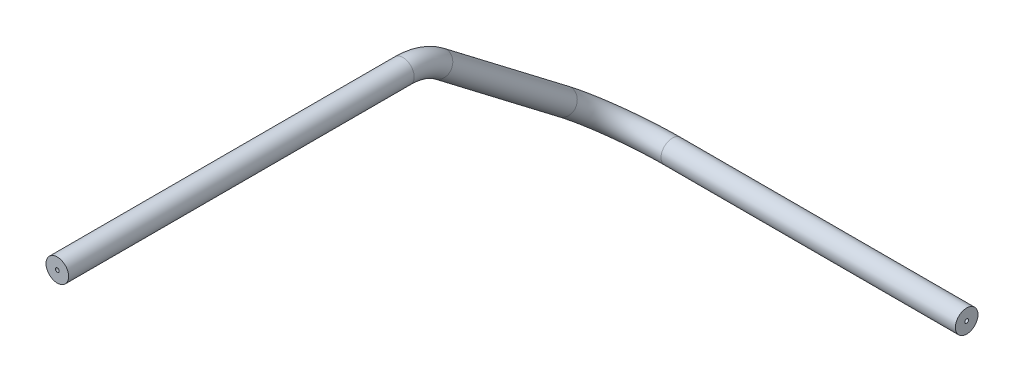
ISO-10303-21;
HEADER;
FILE_DESCRIPTION(('STEP AP214'),'2;1');
FILE_NAME('part.step','',(''),(''),'','','');
FILE_SCHEMA(('AUTOMOTIVE_DESIGN { 1 0 10303 214 1 1 1 1 }'));
ENDSEC;
DATA;
#1=APPLICATION_CONTEXT('core data for automotive mechanical design processes');
#2=APPLICATION_PROTOCOL_DEFINITION('international standard','automotive_design',2000,#1);
#3=PRODUCT_CONTEXT('',#1,'mechanical');
#4=PRODUCT('Part','Part','',(#3));
#5=PRODUCT_RELATED_PRODUCT_CATEGORY('part','',(#4));
#6=PRODUCT_DEFINITION_FORMATION('','',#4);
#7=PRODUCT_DEFINITION_CONTEXT('part definition',#1,'design');
#8=PRODUCT_DEFINITION('design','',#6,#7);
#9=PRODUCT_DEFINITION_SHAPE('','',#8);
#10=(LENGTH_UNIT() NAMED_UNIT(*) SI_UNIT(.MILLI.,.METRE.));
#11=(NAMED_UNIT(*) PLANE_ANGLE_UNIT() SI_UNIT($,.RADIAN.));
#12=(NAMED_UNIT(*) SI_UNIT($,.STERADIAN.) SOLID_ANGLE_UNIT());
#13=UNCERTAINTY_MEASURE_WITH_UNIT(LENGTH_MEASURE(1.E-05),#10,'distance_accuracy_value','');
#14=(GEOMETRIC_REPRESENTATION_CONTEXT(3) GLOBAL_UNCERTAINTY_ASSIGNED_CONTEXT((#13)) GLOBAL_UNIT_ASSIGNED_CONTEXT((#10,
#11,#12)) REPRESENTATION_CONTEXT('',''));
#15=CARTESIAN_POINT('',(0.,0.,0.));
#16=DIRECTION('',(0.,0.,1.));
#17=DIRECTION('',(1.,0.,0.));
#18=AXIS2_PLACEMENT_3D('',#15,#16,#17);
#19=CARTESIAN_POINT('',(94.,0.,0.));
#20=DIRECTION('',(-1.,0.,0.));
#21=DIRECTION('',(0.,-1.,0.));
#22=AXIS2_PLACEMENT_3D('',#19,#20,#21);
#23=CYLINDRICAL_SURFACE('',#22,3.);
#24=CARTESIAN_POINT('',(16.,0.,0.));
#25=DIRECTION('',(1.,0.,0.));
#26=DIRECTION('',(0.,0.,-1.));
#27=AXIS2_PLACEMENT_3D('',#24,#25,#26);
#28=CIRCLE('',#27,3.);
#29=CARTESIAN_POINT('',(16.,-1.82128832393702,-2.38388524075526));
#30=VERTEX_POINT('',#29);
#31=EDGE_CURVE('E61',#30,#30,#28,.T.);
#32=ORIENTED_EDGE('',*,*,#31,.T.);
#33=EDGE_LOOP('',(#32));
#34=FACE_BOUND('',#33,.T.);
#35=CARTESIAN_POINT('',(94.,0.,0.));
#36=DIRECTION('',(1.,0.,0.));
#37=DIRECTION('',(0.,0.,-1.));
#38=AXIS2_PLACEMENT_3D('',#35,#36,#37);
#39=CIRCLE('',#38,3.);
#40=CARTESIAN_POINT('',(94.,0.,-3.));
#41=VERTEX_POINT('',#40);
#42=EDGE_CURVE('E58',#41,#41,#39,.T.);
#43=ORIENTED_EDGE('',*,*,#42,.F.);
#44=EDGE_LOOP('',(#43));
#45=FACE_BOUND('',#44,.T.);
#46=ADVANCED_FACE('F37',(#34,#45),#23,.T.);
#47=CARTESIAN_POINT('',(16.,9.71353772766406,12.7140546173613));
#48=DIRECTION('',(0.,0.794628413585083,-0.607096107979003));
#49=DIRECTION('',(0.,0.607096107979003,0.794628413585083));
#50=AXIS2_PLACEMENT_3D('',#47,#48,#49);
#51=TOROIDAL_SURFACE('',#50,16.,3.);
#52=CARTESIAN_POINT('',(0.,9.71353772766406,12.7140546173613));
#53=DIRECTION('',(0.,-0.607096107979003,-0.794628413585083));
#54=DIRECTION('',(-0.794628413585083,0.482415817177034,-0.368565684323254));
#55=AXIS2_PLACEMENT_3D('',#52,#53,#54);
#56=CIRCLE('',#55,3.);
#57=CARTESIAN_POINT('',(-3.00000000000002,9.71353772766406,12.7140546173613));
#58=VERTEX_POINT('',#57);
#59=EDGE_CURVE('E64',#58,#58,#56,.T.);
#60=CARTESIAN_POINT('',(16.,9.71353772766406,12.7140546173613));
#61=DIRECTION('',(0.,0.794628413585083,-0.607096107979003));
#62=DIRECTION('',(0.,0.607096107979003,0.794628413585083));
#63=AXIS2_PLACEMENT_3D('',#60,#61,#62);
#64=CIRCLE('',#63,19.);
#65=EDGE_CURVE('',#30,#58,#64,.T.);
#66=ORIENTED_EDGE('',*,*,#31,.F.);
#67=ORIENTED_EDGE('',*,*,#59,.T.);
#68=ORIENTED_EDGE('',*,*,#65,.T.);
#69=ORIENTED_EDGE('',*,*,#65,.F.);
#70=EDGE_LOOP('',(#66,#68,#67,#69));
#71=FACE_BOUND('',#70,.T.);
#72=ADVANCED_FACE('F106',(#71),#51,.T.);
#73=CARTESIAN_POINT('',(0.,9.71353772766406,12.7140546173613));
#74=DIRECTION('',(0.,0.607096107979004,0.794628413585083));
#75=DIRECTION('',(0.,-0.794628413585083,0.607096107979004));
#76=AXIS2_PLACEMENT_3D('',#73,#74,#75);
#77=CYLINDRICAL_SURFACE('',#76,3.);
#78=CARTESIAN_POINT('',(0.,34.9140546173614,45.699024368274));
#79=DIRECTION('',(0.,-0.607096107979004,-0.794628413585083));
#80=DIRECTION('',(-0.794628413585083,0.482415817177034,-0.368565684323254));
#81=AXIS2_PLACEMENT_3D('',#78,#79,#80);
#82=CIRCLE('',#81,3.);
#83=CARTESIAN_POINT('',(0.,37.2979398581166,43.877736044337));
#84=VERTEX_POINT('',#83);
#85=EDGE_CURVE('E66',#84,#84,#82,.T.);
#86=ORIENTED_EDGE('',*,*,#85,.T.);
#87=EDGE_LOOP('',(#86));
#88=FACE_BOUND('',#87,.T.);
#89=ORIENTED_EDGE('',*,*,#59,.F.);
#90=EDGE_LOOP('',(#89));
#91=FACE_BOUND('',#90,.T.);
#92=ADVANCED_FACE('F86',(#88,#91),#77,.T.);
#93=CARTESIAN_POINT('',(0.,22.2,55.4125620959381));
#94=DIRECTION('',(1.,0.,0.));
#95=DIRECTION('',(0.,0.,-1.));
#96=AXIS2_PLACEMENT_3D('',#93,#94,#95);
#97=TOROIDAL_SURFACE('',#96,16.,3.);
#98=CARTESIAN_POINT('',(0.,38.2,55.4125620959381));
#99=DIRECTION('',(0.,0.,-1.));
#100=DIRECTION('',(-0.794628413585083,0.607096107979003,0.));
#101=AXIS2_PLACEMENT_3D('',#98,#99,#100);
#102=CIRCLE('',#101,3.);
#103=CARTESIAN_POINT('',(0.,41.2,55.4125620959381));
#104=VERTEX_POINT('',#103);
#105=EDGE_CURVE('E41',#104,#104,#102,.T.);
#106=CARTESIAN_POINT('',(0.,22.2,55.4125620959381));
#107=DIRECTION('',(1.,0.,0.));
#108=DIRECTION('',(0.,0.,-1.));
#109=AXIS2_PLACEMENT_3D('',#106,#107,#108);
#110=CIRCLE('',#109,19.);
#111=EDGE_CURVE('',#84,#104,#110,.T.);
#112=ORIENTED_EDGE('',*,*,#85,.F.);
#113=ORIENTED_EDGE('',*,*,#105,.T.);
#114=ORIENTED_EDGE('',*,*,#111,.T.);
#115=ORIENTED_EDGE('',*,*,#111,.F.);
#116=EDGE_LOOP('',(#112,#114,#113,#115));
#117=FACE_BOUND('',#116,.T.);
#118=ADVANCED_FACE('F73',(#117),#97,.T.);
#119=CARTESIAN_POINT('',(0.,38.2,55.4125620959381));
#120=DIRECTION('',(0.,0.,1.));
#121=DIRECTION('',(0.,-1.,0.));
#122=AXIS2_PLACEMENT_3D('',#119,#120,#121);
#123=CYLINDRICAL_SURFACE('',#122,3.);
#124=CARTESIAN_POINT('',(0.,38.2,147.));
#125=DIRECTION('',(0.,0.,-1.));
#126=DIRECTION('',(-0.794628413585083,0.607096107979003,0.));
#127=AXIS2_PLACEMENT_3D('',#124,#125,#126);
#128=CIRCLE('',#127,3.);
#129=CARTESIAN_POINT('',(-2.38388524075525,40.021288323937,147.));
#130=VERTEX_POINT('',#129);
#131=EDGE_CURVE('E54',#130,#130,#128,.T.);
#132=ORIENTED_EDGE('',*,*,#131,.T.);
#133=EDGE_LOOP('',(#132));
#134=FACE_BOUND('',#133,.T.);
#135=ORIENTED_EDGE('',*,*,#105,.F.);
#136=EDGE_LOOP('',(#135));
#137=FACE_BOUND('',#136,.T.);
#138=ADVANCED_FACE('F39',(#134,#137),#123,.T.);
#139=CARTESIAN_POINT('',(94.,0.,0.));
#140=DIRECTION('',(1.,0.,0.));
#141=DIRECTION('',(0.,0.,-1.));
#142=AXIS2_PLACEMENT_3D('',#139,#140,#141);
#143=PLANE('',#142);
#144=CARTESIAN_POINT('',(94.,0.,0.));
#145=DIRECTION('',(1.,0.,0.));
#146=DIRECTION('',(0.,0.,-1.));
#147=AXIS2_PLACEMENT_3D('',#144,#145,#146);
#148=CIRCLE('',#147,0.5);
#149=CARTESIAN_POINT('',(94.,0.,-0.5));
#150=VERTEX_POINT('',#149);
#151=EDGE_CURVE('E57',#150,#150,#148,.F.);
#152=ORIENTED_EDGE('',*,*,#151,.T.);
#153=EDGE_LOOP('',(#152));
#154=FACE_BOUND('',#153,.T.);
#155=ORIENTED_EDGE('',*,*,#42,.T.);
#156=EDGE_LOOP('',(#155));
#157=FACE_BOUND('',#156,.T.);
#158=ADVANCED_FACE('F77',(#154,#157),#143,.T.);
#159=CARTESIAN_POINT('',(0.,38.2,147.));
#160=DIRECTION('',(0.,0.,-1.));
#161=DIRECTION('',(-0.794628413585083,0.607096107979003,0.));
#162=AXIS2_PLACEMENT_3D('',#159,#160,#161);
#163=PLANE('',#162);
#164=CARTESIAN_POINT('',(0.,38.2,147.));
#165=DIRECTION('',(0.,0.,-1.));
#166=DIRECTION('',(-0.794628413585083,0.607096107979003,0.));
#167=AXIS2_PLACEMENT_3D('',#164,#165,#166);
#168=CIRCLE('',#167,0.5);
#169=CARTESIAN_POINT('',(-0.397314206792542,38.5035480539895,147.));
#170=VERTEX_POINT('',#169);
#171=EDGE_CURVE('E10',#170,#170,#168,.F.);
#172=ORIENTED_EDGE('',*,*,#171,.F.);
#173=EDGE_LOOP('',(#172));
#174=FACE_BOUND('',#173,.T.);
#175=ORIENTED_EDGE('',*,*,#131,.F.);
#176=EDGE_LOOP('',(#175));
#177=FACE_BOUND('',#176,.T.);
#178=ADVANCED_FACE('F83',(#174,#177),#163,.F.);
#179=CARTESIAN_POINT('',(94.,0.,0.));
#180=DIRECTION('',(-1.,0.,0.));
#181=DIRECTION('',(0.,-1.,0.));
#182=AXIS2_PLACEMENT_3D('',#179,#180,#181);
#183=CYLINDRICAL_SURFACE('',#182,0.5);
#184=CARTESIAN_POINT('',(16.,0.,0.));
#185=DIRECTION('',(1.,0.,0.));
#186=DIRECTION('',(0.,0.,-1.));
#187=AXIS2_PLACEMENT_3D('',#184,#185,#186);
#188=CIRCLE('',#187,0.5);
#189=CARTESIAN_POINT('',(16.,-0.303548053989513,-0.397314206792556));
#190=VERTEX_POINT('',#189);
#191=EDGE_CURVE('E191',#190,#190,#188,.F.);
#192=ORIENTED_EDGE('',*,*,#191,.T.);
#193=EDGE_LOOP('',(#192));
#194=FACE_BOUND('',#193,.T.);
#195=ORIENTED_EDGE('',*,*,#151,.F.);
#196=EDGE_LOOP('',(#195));
#197=FACE_BOUND('',#196,.T.);
#198=ADVANCED_FACE('F101',(#194,#197),#183,.F.);
#199=CARTESIAN_POINT('',(16.,9.71353772766406,12.7140546173613));
#200=DIRECTION('',(0.,0.794628413585083,-0.607096107979003));
#201=DIRECTION('',(0.,0.607096107979003,0.794628413585083));
#202=AXIS2_PLACEMENT_3D('',#199,#200,#201);
#203=TOROIDAL_SURFACE('',#202,16.,0.5);
#204=CARTESIAN_POINT('',(0.,9.71353772766406,12.7140546173613));
#205=DIRECTION('',(0.,-0.607096107979003,-0.794628413585083));
#206=DIRECTION('',(-0.794628413585083,0.482415817177034,-0.368565684323254));
#207=AXIS2_PLACEMENT_3D('',#204,#205,#206);
#208=CIRCLE('',#207,0.5);
#209=CARTESIAN_POINT('',(-0.500000000000018,9.71353772766406,12.7140546173613));
#210=VERTEX_POINT('',#209);
#211=EDGE_CURVE('E190',#210,#210,#208,.F.);
#212=CARTESIAN_POINT('',(16.,9.71353772766406,12.7140546173613));
#213=DIRECTION('',(0.,0.794628413585083,-0.607096107979003));
#214=DIRECTION('',(0.,0.607096107979003,0.794628413585083));
#215=AXIS2_PLACEMENT_3D('',#212,#213,#214);
#216=CIRCLE('',#215,16.5);
#217=EDGE_CURVE('',#190,#210,#216,.T.);
#218=ORIENTED_EDGE('',*,*,#191,.F.);
#219=ORIENTED_EDGE('',*,*,#211,.T.);
#220=ORIENTED_EDGE('',*,*,#217,.T.);
#221=ORIENTED_EDGE('',*,*,#217,.F.);
#222=EDGE_LOOP('',(#218,#220,#219,#221));
#223=FACE_BOUND('',#222,.T.);
#224=ADVANCED_FACE('F154',(#223),#203,.F.);
#225=CARTESIAN_POINT('',(0.,9.71353772766406,12.7140546173613));
#226=DIRECTION('',(0.,0.607096107979004,0.794628413585083));
#227=DIRECTION('',(0.,-0.794628413585083,0.607096107979004));
#228=AXIS2_PLACEMENT_3D('',#225,#226,#227);
#229=CYLINDRICAL_SURFACE('',#228,0.5);
#230=CARTESIAN_POINT('',(0.,34.9140546173614,45.699024368274));
#231=DIRECTION('',(0.,-0.607096107979004,-0.794628413585083));
#232=DIRECTION('',(-0.794628413585083,0.482415817177034,-0.368565684323254));
#233=AXIS2_PLACEMENT_3D('',#230,#231,#232);
#234=CIRCLE('',#233,0.5);
#235=CARTESIAN_POINT('',(0.,35.3113688241539,45.3954763142845));
#236=VERTEX_POINT('',#235);
#237=EDGE_CURVE('E50',#236,#236,#234,.F.);
#238=ORIENTED_EDGE('',*,*,#237,.T.);
#239=EDGE_LOOP('',(#238));
#240=FACE_BOUND('',#239,.T.);
#241=ORIENTED_EDGE('',*,*,#211,.F.);
#242=EDGE_LOOP('',(#241));
#243=FACE_BOUND('',#242,.T.);
#244=ADVANCED_FACE('F94',(#240,#243),#229,.F.);
#245=CARTESIAN_POINT('',(0.,22.2,55.4125620959381));
#246=DIRECTION('',(1.,0.,0.));
#247=DIRECTION('',(0.,0.,-1.));
#248=AXIS2_PLACEMENT_3D('',#245,#246,#247);
#249=TOROIDAL_SURFACE('',#248,16.,0.5);
#250=CARTESIAN_POINT('',(0.,38.2,55.4125620959381));
#251=DIRECTION('',(0.,0.,-1.));
#252=DIRECTION('',(-0.794628413585083,0.607096107979003,0.));
#253=AXIS2_PLACEMENT_3D('',#250,#251,#252);
#254=CIRCLE('',#253,0.5);
#255=CARTESIAN_POINT('',(0.,38.7,55.4125620959381));
#256=VERTEX_POINT('',#255);
#257=EDGE_CURVE('E45',#256,#256,#254,.F.);
#258=CARTESIAN_POINT('',(0.,22.2,55.4125620959381));
#259=DIRECTION('',(1.,0.,0.));
#260=DIRECTION('',(0.,0.,-1.));
#261=AXIS2_PLACEMENT_3D('',#258,#259,#260);
#262=CIRCLE('',#261,16.5);
#263=EDGE_CURVE('',#236,#256,#262,.T.);
#264=ORIENTED_EDGE('',*,*,#237,.F.);
#265=ORIENTED_EDGE('',*,*,#257,.T.);
#266=ORIENTED_EDGE('',*,*,#263,.T.);
#267=ORIENTED_EDGE('',*,*,#263,.F.);
#268=EDGE_LOOP('',(#264,#266,#265,#267));
#269=FACE_BOUND('',#268,.T.);
#270=ADVANCED_FACE('F89',(#269),#249,.F.);
#271=CARTESIAN_POINT('',(0.,38.2,55.4125620959381));
#272=DIRECTION('',(0.,0.,1.));
#273=DIRECTION('',(0.,-1.,0.));
#274=AXIS2_PLACEMENT_3D('',#271,#272,#273);
#275=CYLINDRICAL_SURFACE('',#274,0.5);
#276=ORIENTED_EDGE('',*,*,#171,.T.);
#277=EDGE_LOOP('',(#276));
#278=FACE_BOUND('',#277,.T.);
#279=ORIENTED_EDGE('',*,*,#257,.F.);
#280=EDGE_LOOP('',(#279));
#281=FACE_BOUND('',#280,.T.);
#282=ADVANCED_FACE('F87',(#278,#281),#275,.F.);
#283=CLOSED_SHELL('',(#46,#72,#92,#118,#138,#158,#178,#198,#224,#244,#270,#282));
#284=MANIFOLD_SOLID_BREP('B2',#283);
#285=ADVANCED_BREP_SHAPE_REPRESENTATION('',(#18,#284),#14);
#286=SHAPE_DEFINITION_REPRESENTATION(#9,#285);
ENDSEC;
END-ISO-10303-21;
